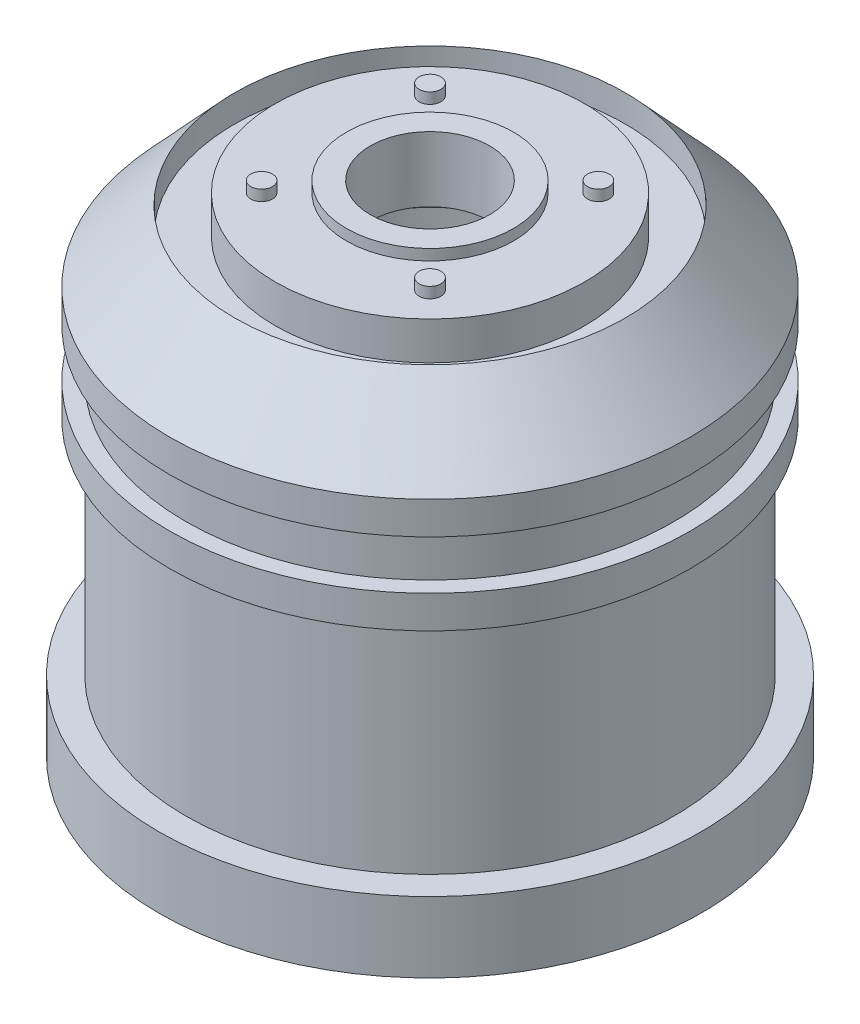
ISO-10303-21;
HEADER;
FILE_DESCRIPTION(('STEP AP214'),'2;1');
FILE_NAME('part.step','',(''),(''),'','','');
FILE_SCHEMA(('AUTOMOTIVE_DESIGN { 1 0 10303 214 1 1 1 1 }'));
ENDSEC;
DATA;
#1=APPLICATION_CONTEXT('core data for automotive mechanical design processes');
#2=APPLICATION_PROTOCOL_DEFINITION('international standard','automotive_design',2000,#1);
#3=PRODUCT_CONTEXT('',#1,'mechanical');
#4=PRODUCT('Part','Part','',(#3));
#5=PRODUCT_RELATED_PRODUCT_CATEGORY('part','',(#4));
#6=PRODUCT_DEFINITION_FORMATION('','',#4);
#7=PRODUCT_DEFINITION_CONTEXT('part definition',#1,'design');
#8=PRODUCT_DEFINITION('design','',#6,#7);
#9=PRODUCT_DEFINITION_SHAPE('','',#8);
#10=(LENGTH_UNIT() NAMED_UNIT(*) SI_UNIT(.MILLI.,.METRE.));
#11=(NAMED_UNIT(*) PLANE_ANGLE_UNIT() SI_UNIT($,.RADIAN.));
#12=(NAMED_UNIT(*) SI_UNIT($,.STERADIAN.) SOLID_ANGLE_UNIT());
#13=UNCERTAINTY_MEASURE_WITH_UNIT(LENGTH_MEASURE(1.E-05),#10,'distance_accuracy_value','');
#14=(GEOMETRIC_REPRESENTATION_CONTEXT(3) GLOBAL_UNCERTAINTY_ASSIGNED_CONTEXT((#13)) GLOBAL_UNIT_ASSIGNED_CONTEXT((#10,
#11,#12)) REPRESENTATION_CONTEXT('',''));
#15=CARTESIAN_POINT('',(0.,0.,0.));
#16=DIRECTION('',(0.,0.,1.));
#17=DIRECTION('',(1.,0.,0.));
#18=AXIS2_PLACEMENT_3D('',#15,#16,#17);
#19=CARTESIAN_POINT('',(0.,20.32,0.));
#20=DIRECTION('',(0.,-1.,0.));
#21=DIRECTION('',(0.,0.,-1.));
#22=AXIS2_PLACEMENT_3D('',#19,#20,#21);
#23=PLANE('',#22);
#24=CARTESIAN_POINT('',(0.,20.32,0.));
#25=DIRECTION('',(0.,-1.,0.));
#26=DIRECTION('',(0.,0.,-1.));
#27=AXIS2_PLACEMENT_3D('',#24,#25,#26);
#28=CIRCLE('',#27,2.794);
#29=CARTESIAN_POINT('',(0.,20.32,-2.794));
#30=VERTEX_POINT('',#29);
#31=EDGE_CURVE('E98',#30,#30,#28,.F.);
#32=ORIENTED_EDGE('',*,*,#31,.T.);
#33=EDGE_LOOP('',(#32));
#34=FACE_BOUND('',#33,.T.);
#35=CARTESIAN_POINT('',(0.,20.32,0.));
#36=DIRECTION('',(0.,-1.,0.));
#37=DIRECTION('',(0.,0.,-1.));
#38=AXIS2_PLACEMENT_3D('',#35,#36,#37);
#39=CIRCLE('',#38,6.35);
#40=CARTESIAN_POINT('',(0.,20.32,-6.35));
#41=VERTEX_POINT('',#40);
#42=EDGE_CURVE('E45',#41,#41,#39,.F.);
#43=ORIENTED_EDGE('',*,*,#42,.F.);
#44=EDGE_LOOP('',(#43));
#45=FACE_BOUND('',#44,.T.);
#46=ADVANCED_FACE('F37',(#34,#45),#23,.T.);
#47=CARTESIAN_POINT('',(0.,3.302,0.));
#48=DIRECTION('',(0.,-1.,0.));
#49=DIRECTION('',(0.,0.,-1.));
#50=AXIS2_PLACEMENT_3D('',#47,#48,#49);
#51=CYLINDRICAL_SURFACE('',#50,12.7);
#52=CARTESIAN_POINT('',(0.,3.302,0.));
#53=DIRECTION('',(0.,1.,0.));
#54=DIRECTION('',(0.,0.,1.));
#55=AXIS2_PLACEMENT_3D('',#52,#53,#54);
#56=CIRCLE('',#55,12.7);
#57=CARTESIAN_POINT('',(0.,3.302,-12.7));
#58=VERTEX_POINT('',#57);
#59=EDGE_CURVE('E62',#58,#58,#56,.T.);
#60=CARTESIAN_POINT('',(0.,0.,0.));
#61=DIRECTION('',(0.,1.,0.));
#62=DIRECTION('',(0.,0.,1.));
#63=AXIS2_PLACEMENT_3D('',#60,#61,#62);
#64=CIRCLE('',#63,12.7);
#65=CARTESIAN_POINT('',(0.,0.,-12.7));
#66=VERTEX_POINT('',#65);
#67=EDGE_CURVE('E58',#66,#66,#64,.T.);
#68=CARTESIAN_POINT('',(0.,3.302,-12.7));
#69=CARTESIAN_POINT('',(0.,3.26760416666667,-12.7));
#70=CARTESIAN_POINT('',(0.,3.23320833333333,-12.7));
#71=CARTESIAN_POINT('',(0.,3.16441666666667,-12.7));
#72=CARTESIAN_POINT('',(0.,3.13002083333333,-12.7));
#73=CARTESIAN_POINT('',(0.,3.06122916666667,-12.7));
#74=CARTESIAN_POINT('',(0.,3.02683333333333,-12.7));
#75=CARTESIAN_POINT('',(0.,2.95804166666667,-12.7));
#76=CARTESIAN_POINT('',(0.,2.92364583333333,-12.7));
#77=CARTESIAN_POINT('',(0.,2.85485416666667,-12.7));
#78=CARTESIAN_POINT('',(0.,2.82045833333333,-12.7));
#79=CARTESIAN_POINT('',(0.,2.75166666666667,-12.7));
#80=CARTESIAN_POINT('',(0.,2.71727083333333,-12.7));
#81=CARTESIAN_POINT('',(0.,2.64847916666667,-12.7));
#82=CARTESIAN_POINT('',(0.,2.61408333333333,-12.7));
#83=CARTESIAN_POINT('',(0.,2.54529166666667,-12.7));
#84=CARTESIAN_POINT('',(0.,2.51089583333333,-12.7));
#85=CARTESIAN_POINT('',(0.,2.44210416666667,-12.7));
#86=CARTESIAN_POINT('',(0.,2.40770833333333,-12.7));
#87=CARTESIAN_POINT('',(0.,2.33891666666667,-12.7));
#88=CARTESIAN_POINT('',(0.,2.30452083333333,-12.7));
#89=CARTESIAN_POINT('',(0.,2.23572916666667,-12.7));
#90=CARTESIAN_POINT('',(0.,2.20133333333333,-12.7));
#91=CARTESIAN_POINT('',(0.,2.13254166666667,-12.7));
#92=CARTESIAN_POINT('',(0.,2.09814583333333,-12.7));
#93=CARTESIAN_POINT('',(0.,2.02935416666667,-12.7));
#94=CARTESIAN_POINT('',(0.,1.99495833333333,-12.7));
#95=CARTESIAN_POINT('',(0.,1.92616666666667,-12.7));
#96=CARTESIAN_POINT('',(0.,1.89177083333333,-12.7));
#97=CARTESIAN_POINT('',(0.,1.82297916666667,-12.7));
#98=CARTESIAN_POINT('',(0.,1.78858333333333,-12.7));
#99=CARTESIAN_POINT('',(0.,1.71979166666667,-12.7));
#100=CARTESIAN_POINT('',(0.,1.68539583333333,-12.7));
#101=CARTESIAN_POINT('',(0.,1.61660416666667,-12.7));
#102=CARTESIAN_POINT('',(0.,1.58220833333333,-12.7));
#103=CARTESIAN_POINT('',(0.,1.51341666666667,-12.7));
#104=CARTESIAN_POINT('',(0.,1.47902083333333,-12.7));
#105=CARTESIAN_POINT('',(0.,1.41022916666667,-12.7));
#106=CARTESIAN_POINT('',(0.,1.37583333333333,-12.7));
#107=CARTESIAN_POINT('',(0.,1.30704166666667,-12.7));
#108=CARTESIAN_POINT('',(0.,1.27264583333333,-12.7));
#109=CARTESIAN_POINT('',(0.,1.20385416666667,-12.7));
#110=CARTESIAN_POINT('',(0.,1.16945833333333,-12.7));
#111=CARTESIAN_POINT('',(0.,1.10066666666667,-12.7));
#112=CARTESIAN_POINT('',(0.,1.06627083333333,-12.7));
#113=CARTESIAN_POINT('',(0.,0.997479166666666,-12.7));
#114=CARTESIAN_POINT('',(0.,0.963083333333333,-12.7));
#115=CARTESIAN_POINT('',(0.,0.894291666666666,-12.7));
#116=CARTESIAN_POINT('',(0.,0.859895833333333,-12.7));
#117=CARTESIAN_POINT('',(0.,0.791104166666666,-12.7));
#118=CARTESIAN_POINT('',(0.,0.756708333333333,-12.7));
#119=CARTESIAN_POINT('',(0.,0.687916666666667,-12.7));
#120=CARTESIAN_POINT('',(0.,0.653520833333333,-12.7));
#121=CARTESIAN_POINT('',(0.,0.584729166666667,-12.7));
#122=CARTESIAN_POINT('',(0.,0.550333333333333,-12.7));
#123=CARTESIAN_POINT('',(0.,0.481541666666667,-12.7));
#124=CARTESIAN_POINT('',(0.,0.447145833333333,-12.7));
#125=CARTESIAN_POINT('',(0.,0.378354166666667,-12.7));
#126=CARTESIAN_POINT('',(0.,0.343958333333333,-12.7));
#127=CARTESIAN_POINT('',(0.,0.275166666666667,-12.7));
#128=CARTESIAN_POINT('',(0.,0.240770833333333,-12.7));
#129=CARTESIAN_POINT('',(0.,0.171979166666667,-12.7));
#130=CARTESIAN_POINT('',(0.,0.137583333333333,-12.7));
#131=CARTESIAN_POINT('',(0.,0.0687916666666666,-12.7));
#132=CARTESIAN_POINT('',(0.,0.0343958333333333,-12.7));
#133=CARTESIAN_POINT('',(0.,0.,-12.7));
#134=B_SPLINE_CURVE_WITH_KNOTS('',3,(#68,#69,#70,#71,#72,#73,#74,#75,#76,#77,#78,#79,#80,#81,
#82,#83,#84,#85,#86,#87,#88,#89,#90,#91,#92,#93,#94,#95,#96,#97,#98,#99,#100,#101,#102,#103,
#104,#105,#106,#107,#108,#109,#110,#111,#112,#113,#114,#115,#116,#117,#118,#119,#120,#121,#122,
#123,#124,#125,#126,#127,#128,#129,#130,#131,#132,#133),.UNSPECIFIED.,.F.,.F.,(4,2,2,2,2,2,2,2,
2,2,2,2,2,2,2,2,2,2,2,2,2,2,2,2,2,2,2,2,2,2,2,2,4),(0.,0.1031875,0.206375,0.3095625,0.41275,
0.5159375,0.619125,0.7223125,0.8255,0.9286875,1.031875,1.1350625,1.23825,1.3414375,1.444625,
1.5478125,1.651,1.7541875,1.857375,1.9605625,2.06375,2.1669375,2.270125,2.3733125,2.4765,
2.5796875,2.682875,2.7860625,2.88925,2.9924375,3.095625,3.1988125,3.302),.UNSPECIFIED.);
#135=EDGE_CURVE('BSEAM39',#58,#66,#134,.T.);
#136=ORIENTED_EDGE('',*,*,#59,.F.);
#137=ORIENTED_EDGE('',*,*,#67,.T.);
#138=ORIENTED_EDGE('',*,*,#135,.T.);
#139=ORIENTED_EDGE('',*,*,#135,.F.);
#140=EDGE_LOOP('',(#136,#138,#137,#139));
#141=FACE_BOUND('',#140,.T.);
#142=ADVANCED_FACE('F39',(#141),#51,.T.);
#143=CARTESIAN_POINT('',(0.,3.302,0.));
#144=DIRECTION('',(0.,1.,0.));
#145=DIRECTION('',(0.,0.,1.));
#146=AXIS2_PLACEMENT_3D('',#143,#144,#145);
#147=PLANE('',#146);
#148=CARTESIAN_POINT('',(0.,3.302,0.));
#149=DIRECTION('',(0.,1.,0.));
#150=DIRECTION('',(0.,0.,1.));
#151=AXIS2_PLACEMENT_3D('',#148,#149,#150);
#152=CIRCLE('',#151,11.43);
#153=CARTESIAN_POINT('',(0.,3.302,11.43));
#154=VERTEX_POINT('',#153);
#155=EDGE_CURVE('E55',#154,#154,#152,.T.);
#156=ORIENTED_EDGE('',*,*,#155,.F.);
#157=EDGE_LOOP('',(#156));
#158=FACE_BOUND('',#157,.T.);
#159=ORIENTED_EDGE('',*,*,#59,.T.);
#160=EDGE_LOOP('',(#159));
#161=FACE_BOUND('',#160,.T.);
#162=ADVANCED_FACE('F245',(#158,#161),#147,.T.);
#163=CARTESIAN_POINT('',(0.,0.,0.));
#164=DIRECTION('',(0.,1.,0.));
#165=DIRECTION('',(0.,0.,1.));
#166=AXIS2_PLACEMENT_3D('',#163,#164,#165);
#167=PLANE('',#166);
#168=CARTESIAN_POINT('',(0.,0.,0.));
#169=DIRECTION('',(0.,-1.,0.));
#170=DIRECTION('',(0.,0.,-1.));
#171=AXIS2_PLACEMENT_3D('',#168,#169,#170);
#172=CIRCLE('',#171,9.525);
#173=CARTESIAN_POINT('',(0.,0.,-9.525));
#174=VERTEX_POINT('',#173);
#175=EDGE_CURVE('E90',#174,#174,#172,.T.);
#176=ORIENTED_EDGE('',*,*,#175,.F.);
#177=EDGE_LOOP('',(#176));
#178=FACE_BOUND('',#177,.T.);
#179=ORIENTED_EDGE('',*,*,#67,.F.);
#180=EDGE_LOOP('',(#179));
#181=FACE_BOUND('',#180,.T.);
#182=ADVANCED_FACE('F406',(#178,#181),#167,.F.);
#183=CARTESIAN_POINT('',(0.,13.716,0.));
#184=DIRECTION('',(0.,-1.,0.));
#185=DIRECTION('',(0.,0.,-1.));
#186=AXIS2_PLACEMENT_3D('',#183,#184,#185);
#187=CYLINDRICAL_SURFACE('',#186,11.43);
#188=CARTESIAN_POINT('',(0.,13.716,0.));
#189=DIRECTION('',(0.,1.,0.));
#190=DIRECTION('',(0.,0.,1.));
#191=AXIS2_PLACEMENT_3D('',#188,#189,#190);
#192=CIRCLE('',#191,11.43);
#193=CARTESIAN_POINT('',(0.,13.716,11.43));
#194=VERTEX_POINT('',#193);
#195=EDGE_CURVE('E63',#194,#194,#192,.T.);
#196=ORIENTED_EDGE('',*,*,#195,.F.);
#197=EDGE_LOOP('',(#196));
#198=FACE_BOUND('',#197,.T.);
#199=ORIENTED_EDGE('',*,*,#155,.T.);
#200=EDGE_LOOP('',(#199));
#201=FACE_BOUND('',#200,.T.);
#202=ADVANCED_FACE('F410',(#198,#201),#187,.T.);
#203=CARTESIAN_POINT('',(0.,15.24,0.));
#204=DIRECTION('',(0.,-1.,0.));
#205=DIRECTION('',(0.,0.,-1.));
#206=AXIS2_PLACEMENT_3D('',#203,#204,#205);
#207=CYLINDRICAL_SURFACE('',#206,12.192);
#208=CARTESIAN_POINT('',(0.,15.24,0.));
#209=DIRECTION('',(0.,1.,0.));
#210=DIRECTION('',(0.,0.,1.));
#211=AXIS2_PLACEMENT_3D('',#208,#209,#210);
#212=CIRCLE('',#211,12.192);
#213=CARTESIAN_POINT('',(0.,15.24,-12.192));
#214=VERTEX_POINT('',#213);
#215=EDGE_CURVE('E73',#214,#214,#212,.T.);
#216=CARTESIAN_POINT('',(0.,13.716,0.));
#217=DIRECTION('',(0.,1.,0.));
#218=DIRECTION('',(0.,0.,1.));
#219=AXIS2_PLACEMENT_3D('',#216,#217,#218);
#220=CIRCLE('',#219,12.192);
#221=CARTESIAN_POINT('',(0.,13.716,-12.192));
#222=VERTEX_POINT('',#221);
#223=EDGE_CURVE('E74',#222,#222,#220,.T.);
#224=CARTESIAN_POINT('',(0.,15.24,-12.192));
#225=CARTESIAN_POINT('',(0.,15.224125,-12.192));
#226=CARTESIAN_POINT('',(0.,15.20825,-12.192));
#227=CARTESIAN_POINT('',(0.,15.1765,-12.192));
#228=CARTESIAN_POINT('',(0.,15.160625,-12.192));
#229=CARTESIAN_POINT('',(0.,15.128875,-12.192));
#230=CARTESIAN_POINT('',(0.,15.113,-12.192));
#231=CARTESIAN_POINT('',(0.,15.08125,-12.192));
#232=CARTESIAN_POINT('',(0.,15.065375,-12.192));
#233=CARTESIAN_POINT('',(0.,15.033625,-12.192));
#234=CARTESIAN_POINT('',(0.,15.01775,-12.192));
#235=CARTESIAN_POINT('',(0.,14.986,-12.192));
#236=CARTESIAN_POINT('',(0.,14.970125,-12.192));
#237=CARTESIAN_POINT('',(0.,14.938375,-12.192));
#238=CARTESIAN_POINT('',(0.,14.9225,-12.192));
#239=CARTESIAN_POINT('',(0.,14.89075,-12.192));
#240=CARTESIAN_POINT('',(0.,14.874875,-12.192));
#241=CARTESIAN_POINT('',(0.,14.843125,-12.192));
#242=CARTESIAN_POINT('',(0.,14.82725,-12.192));
#243=CARTESIAN_POINT('',(0.,14.7955,-12.192));
#244=CARTESIAN_POINT('',(0.,14.779625,-12.192));
#245=CARTESIAN_POINT('',(0.,14.747875,-12.192));
#246=CARTESIAN_POINT('',(0.,14.732,-12.192));
#247=CARTESIAN_POINT('',(0.,14.70025,-12.192));
#248=CARTESIAN_POINT('',(0.,14.684375,-12.192));
#249=CARTESIAN_POINT('',(0.,14.652625,-12.192));
#250=CARTESIAN_POINT('',(0.,14.63675,-12.192));
#251=CARTESIAN_POINT('',(0.,14.605,-12.192));
#252=CARTESIAN_POINT('',(0.,14.589125,-12.192));
#253=CARTESIAN_POINT('',(0.,14.557375,-12.192));
#254=CARTESIAN_POINT('',(0.,14.5415,-12.192));
#255=CARTESIAN_POINT('',(0.,14.50975,-12.192));
#256=CARTESIAN_POINT('',(0.,14.493875,-12.192));
#257=CARTESIAN_POINT('',(0.,14.462125,-12.192));
#258=CARTESIAN_POINT('',(0.,14.44625,-12.192));
#259=CARTESIAN_POINT('',(0.,14.4145,-12.192));
#260=CARTESIAN_POINT('',(0.,14.398625,-12.192));
#261=CARTESIAN_POINT('',(0.,14.366875,-12.192));
#262=CARTESIAN_POINT('',(0.,14.351,-12.192));
#263=CARTESIAN_POINT('',(0.,14.31925,-12.192));
#264=CARTESIAN_POINT('',(0.,14.303375,-12.192));
#265=CARTESIAN_POINT('',(0.,14.271625,-12.192));
#266=CARTESIAN_POINT('',(0.,14.25575,-12.192));
#267=CARTESIAN_POINT('',(0.,14.224,-12.192));
#268=CARTESIAN_POINT('',(0.,14.208125,-12.192));
#269=CARTESIAN_POINT('',(0.,14.176375,-12.192));
#270=CARTESIAN_POINT('',(0.,14.1605,-12.192));
#271=CARTESIAN_POINT('',(0.,14.12875,-12.192));
#272=CARTESIAN_POINT('',(0.,14.112875,-12.192));
#273=CARTESIAN_POINT('',(0.,14.081125,-12.192));
#274=CARTESIAN_POINT('',(0.,14.06525,-12.192));
#275=CARTESIAN_POINT('',(0.,14.0335,-12.192));
#276=CARTESIAN_POINT('',(0.,14.017625,-12.192));
#277=CARTESIAN_POINT('',(0.,13.985875,-12.192));
#278=CARTESIAN_POINT('',(0.,13.97,-12.192));
#279=CARTESIAN_POINT('',(0.,13.93825,-12.192));
#280=CARTESIAN_POINT('',(0.,13.922375,-12.192));
#281=CARTESIAN_POINT('',(0.,13.890625,-12.192));
#282=CARTESIAN_POINT('',(0.,13.87475,-12.192));
#283=CARTESIAN_POINT('',(0.,13.843,-12.192));
#284=CARTESIAN_POINT('',(0.,13.827125,-12.192));
#285=CARTESIAN_POINT('',(0.,13.795375,-12.192));
#286=CARTESIAN_POINT('',(0.,13.7795,-12.192));
#287=CARTESIAN_POINT('',(0.,13.74775,-12.192));
#288=CARTESIAN_POINT('',(0.,13.731875,-12.192));
#289=CARTESIAN_POINT('',(0.,13.716,-12.192));
#290=B_SPLINE_CURVE_WITH_KNOTS('',3,(#224,#225,#226,#227,#228,#229,#230,#231,#232,#233,#234,
#235,#236,#237,#238,#239,#240,#241,#242,#243,#244,#245,#246,#247,#248,#249,#250,#251,#252,#253,
#254,#255,#256,#257,#258,#259,#260,#261,#262,#263,#264,#265,#266,#267,#268,#269,#270,#271,#272,
#273,#274,#275,#276,#277,#278,#279,#280,#281,#282,#283,#284,#285,#286,#287,#288,#289),
.UNSPECIFIED.,.F.,.F.,(4,2,2,2,2,2,2,2,2,2,2,2,2,2,2,2,2,2,2,2,2,2,2,2,2,2,2,2,2,2,2,2,4),(0.,
0.0476250000000008,0.0952500000000016,0.142875000000001,0.190500000000001,0.238125,
0.285750000000001,0.333375,0.381000000000001,0.428625,0.476250000000001,0.523875,
0.571500000000001,0.619125,0.666750000000001,0.714375000000001,0.762000000000001,
0.809625000000001,0.85725,0.904875000000001,0.9525,1.000125,1.04775,1.095375,1.143,1.190625,
1.23825,1.285875,1.3335,1.381125,1.42875,1.476375,1.524),.UNSPECIFIED.);
#291=EDGE_CURVE('BSEAM447',#214,#222,#290,.T.);
#292=ORIENTED_EDGE('',*,*,#215,.F.);
#293=ORIENTED_EDGE('',*,*,#223,.T.);
#294=ORIENTED_EDGE('',*,*,#291,.T.);
#295=ORIENTED_EDGE('',*,*,#291,.F.);
#296=EDGE_LOOP('',(#292,#294,#293,#295));
#297=FACE_BOUND('',#296,.T.);
#298=ADVANCED_FACE('F447',(#297),#207,.T.);
#299=CARTESIAN_POINT('',(0.,15.24,0.));
#300=DIRECTION('',(0.,1.,0.));
#301=DIRECTION('',(0.,0.,1.));
#302=AXIS2_PLACEMENT_3D('',#299,#300,#301);
#303=PLANE('',#302);
#304=CARTESIAN_POINT('',(0.,15.24,0.));
#305=DIRECTION('',(0.,1.,0.));
#306=DIRECTION('',(0.,0.,1.));
#307=AXIS2_PLACEMENT_3D('',#304,#305,#306);
#308=CIRCLE('',#307,11.43);
#309=CARTESIAN_POINT('',(0.,15.24,11.43));
#310=VERTEX_POINT('',#309);
#311=EDGE_CURVE('E50',#310,#310,#308,.T.);
#312=ORIENTED_EDGE('',*,*,#311,.F.);
#313=EDGE_LOOP('',(#312));
#314=FACE_BOUND('',#313,.T.);
#315=ORIENTED_EDGE('',*,*,#215,.T.);
#316=EDGE_LOOP('',(#315));
#317=FACE_BOUND('',#316,.T.);
#318=ADVANCED_FACE('F442',(#314,#317),#303,.T.);
#319=CARTESIAN_POINT('',(0.,13.716,0.));
#320=DIRECTION('',(0.,1.,0.));
#321=DIRECTION('',(0.,0.,1.));
#322=AXIS2_PLACEMENT_3D('',#319,#320,#321);
#323=PLANE('',#322);
#324=ORIENTED_EDGE('',*,*,#195,.T.);
#325=EDGE_LOOP('',(#324));
#326=FACE_BOUND('',#325,.T.);
#327=ORIENTED_EDGE('',*,*,#223,.F.);
#328=EDGE_LOOP('',(#327));
#329=FACE_BOUND('',#328,.T.);
#330=ADVANCED_FACE('F434',(#326,#329),#323,.F.);
#331=CARTESIAN_POINT('',(0.,17.526,0.));
#332=DIRECTION('',(0.,-1.,0.));
#333=DIRECTION('',(0.,0.,-1.));
#334=AXIS2_PLACEMENT_3D('',#331,#332,#333);
#335=CYLINDRICAL_SURFACE('',#334,11.43);
#336=CARTESIAN_POINT('',(0.,17.526,0.));
#337=DIRECTION('',(0.,1.,0.));
#338=DIRECTION('',(0.,0.,1.));
#339=AXIS2_PLACEMENT_3D('',#336,#337,#338);
#340=CIRCLE('',#339,11.43);
#341=CARTESIAN_POINT('',(0.,17.526,11.43));
#342=VERTEX_POINT('',#341);
#343=EDGE_CURVE('E78',#342,#342,#340,.T.);
#344=ORIENTED_EDGE('',*,*,#343,.F.);
#345=EDGE_LOOP('',(#344));
#346=FACE_BOUND('',#345,.T.);
#347=ORIENTED_EDGE('',*,*,#311,.T.);
#348=EDGE_LOOP('',(#347));
#349=FACE_BOUND('',#348,.T.);
#350=ADVANCED_FACE('F226',(#346,#349),#335,.T.);
#351=CARTESIAN_POINT('',(0.,19.05,0.));
#352=DIRECTION('',(0.,-1.,0.));
#353=DIRECTION('',(0.,0.,-1.));
#354=AXIS2_PLACEMENT_3D('',#351,#352,#353);
#355=CYLINDRICAL_SURFACE('',#354,12.192);
#356=CARTESIAN_POINT('',(0.,19.05,0.));
#357=DIRECTION('',(0.,1.,0.));
#358=DIRECTION('',(0.,0.,1.));
#359=AXIS2_PLACEMENT_3D('',#356,#357,#358);
#360=CIRCLE('',#359,12.192);
#361=CARTESIAN_POINT('',(0.,19.05,-12.192));
#362=VERTEX_POINT('',#361);
#363=EDGE_CURVE('E85',#362,#362,#360,.T.);
#364=CARTESIAN_POINT('',(0.,17.526,0.));
#365=DIRECTION('',(0.,1.,0.));
#366=DIRECTION('',(0.,0.,1.));
#367=AXIS2_PLACEMENT_3D('',#364,#365,#366);
#368=CIRCLE('',#367,12.192);
#369=CARTESIAN_POINT('',(0.,17.526,-12.192));
#370=VERTEX_POINT('',#369);
#371=EDGE_CURVE('E86',#370,#370,#368,.T.);
#372=CARTESIAN_POINT('',(0.,19.05,-12.192));
#373=CARTESIAN_POINT('',(0.,19.034125,-12.192));
#374=CARTESIAN_POINT('',(0.,19.01825,-12.192));
#375=CARTESIAN_POINT('',(0.,18.9865,-12.192));
#376=CARTESIAN_POINT('',(0.,18.970625,-12.192));
#377=CARTESIAN_POINT('',(0.,18.938875,-12.192));
#378=CARTESIAN_POINT('',(0.,18.923,-12.192));
#379=CARTESIAN_POINT('',(0.,18.89125,-12.192));
#380=CARTESIAN_POINT('',(0.,18.875375,-12.192));
#381=CARTESIAN_POINT('',(0.,18.843625,-12.192));
#382=CARTESIAN_POINT('',(0.,18.82775,-12.192));
#383=CARTESIAN_POINT('',(0.,18.796,-12.192));
#384=CARTESIAN_POINT('',(0.,18.780125,-12.192));
#385=CARTESIAN_POINT('',(0.,18.748375,-12.192));
#386=CARTESIAN_POINT('',(0.,18.7325,-12.192));
#387=CARTESIAN_POINT('',(0.,18.70075,-12.192));
#388=CARTESIAN_POINT('',(0.,18.684875,-12.192));
#389=CARTESIAN_POINT('',(0.,18.653125,-12.192));
#390=CARTESIAN_POINT('',(0.,18.63725,-12.192));
#391=CARTESIAN_POINT('',(0.,18.6055,-12.192));
#392=CARTESIAN_POINT('',(0.,18.589625,-12.192));
#393=CARTESIAN_POINT('',(0.,18.557875,-12.192));
#394=CARTESIAN_POINT('',(0.,18.542,-12.192));
#395=CARTESIAN_POINT('',(0.,18.51025,-12.192));
#396=CARTESIAN_POINT('',(0.,18.494375,-12.192));
#397=CARTESIAN_POINT('',(0.,18.462625,-12.192));
#398=CARTESIAN_POINT('',(0.,18.44675,-12.192));
#399=CARTESIAN_POINT('',(0.,18.415,-12.192));
#400=CARTESIAN_POINT('',(0.,18.399125,-12.192));
#401=CARTESIAN_POINT('',(0.,18.367375,-12.192));
#402=CARTESIAN_POINT('',(0.,18.3515,-12.192));
#403=CARTESIAN_POINT('',(0.,18.31975,-12.192));
#404=CARTESIAN_POINT('',(0.,18.303875,-12.192));
#405=CARTESIAN_POINT('',(0.,18.272125,-12.192));
#406=CARTESIAN_POINT('',(0.,18.25625,-12.192));
#407=CARTESIAN_POINT('',(0.,18.2245,-12.192));
#408=CARTESIAN_POINT('',(0.,18.208625,-12.192));
#409=CARTESIAN_POINT('',(0.,18.176875,-12.192));
#410=CARTESIAN_POINT('',(0.,18.161,-12.192));
#411=CARTESIAN_POINT('',(0.,18.12925,-12.192));
#412=CARTESIAN_POINT('',(0.,18.113375,-12.192));
#413=CARTESIAN_POINT('',(0.,18.081625,-12.192));
#414=CARTESIAN_POINT('',(0.,18.06575,-12.192));
#415=CARTESIAN_POINT('',(0.,18.034,-12.192));
#416=CARTESIAN_POINT('',(0.,18.018125,-12.192));
#417=CARTESIAN_POINT('',(0.,17.986375,-12.192));
#418=CARTESIAN_POINT('',(0.,17.9705,-12.192));
#419=CARTESIAN_POINT('',(0.,17.93875,-12.192));
#420=CARTESIAN_POINT('',(0.,17.922875,-12.192));
#421=CARTESIAN_POINT('',(0.,17.891125,-12.192));
#422=CARTESIAN_POINT('',(0.,17.87525,-12.192));
#423=CARTESIAN_POINT('',(0.,17.8435,-12.192));
#424=CARTESIAN_POINT('',(0.,17.827625,-12.192));
#425=CARTESIAN_POINT('',(0.,17.795875,-12.192));
#426=CARTESIAN_POINT('',(0.,17.78,-12.192));
#427=CARTESIAN_POINT('',(0.,17.74825,-12.192));
#428=CARTESIAN_POINT('',(0.,17.732375,-12.192));
#429=CARTESIAN_POINT('',(0.,17.700625,-12.192));
#430=CARTESIAN_POINT('',(0.,17.68475,-12.192));
#431=CARTESIAN_POINT('',(0.,17.653,-12.192));
#432=CARTESIAN_POINT('',(0.,17.637125,-12.192));
#433=CARTESIAN_POINT('',(0.,17.605375,-12.192));
#434=CARTESIAN_POINT('',(0.,17.5895,-12.192));
#435=CARTESIAN_POINT('',(0.,17.55775,-12.192));
#436=CARTESIAN_POINT('',(0.,17.541875,-12.192));
#437=CARTESIAN_POINT('',(0.,17.526,-12.192));
#438=B_SPLINE_CURVE_WITH_KNOTS('',3,(#372,#373,#374,#375,#376,#377,#378,#379,#380,#381,#382,
#383,#384,#385,#386,#387,#388,#389,#390,#391,#392,#393,#394,#395,#396,#397,#398,#399,#400,#401,
#402,#403,#404,#405,#406,#407,#408,#409,#410,#411,#412,#413,#414,#415,#416,#417,#418,#419,#420,
#421,#422,#423,#424,#425,#426,#427,#428,#429,#430,#431,#432,#433,#434,#435,#436,#437),
.UNSPECIFIED.,.F.,.F.,(4,2,2,2,2,2,2,2,2,2,2,2,2,2,2,2,2,2,2,2,2,2,2,2,2,2,2,2,2,2,2,2,4),(0.,
0.0476250000000025,0.0952500000000016,0.142875000000001,0.190500000000003,0.238125000000002,
0.285750000000001,0.333375,0.381000000000003,0.428625000000002,0.476250000000001,
0.523875000000004,0.571500000000003,0.619125000000002,0.666750000000001,0.714375000000003,
0.762000000000002,0.809625000000001,0.857250000000004,0.904875000000003,0.952500000000002,
1.000125,1.04775,1.095375,1.143,1.190625,1.23825,1.285875,1.3335,1.381125,1.42875,1.476375,
1.524),.UNSPECIFIED.);
#439=EDGE_CURVE('BSEAM222',#362,#370,#438,.T.);
#440=ORIENTED_EDGE('',*,*,#363,.F.);
#441=ORIENTED_EDGE('',*,*,#371,.T.);
#442=ORIENTED_EDGE('',*,*,#439,.T.);
#443=ORIENTED_EDGE('',*,*,#439,.F.);
#444=EDGE_LOOP('',(#440,#442,#441,#443));
#445=FACE_BOUND('',#444,.T.);
#446=ADVANCED_FACE('F222',(#445),#355,.T.);
#447=CARTESIAN_POINT('',(0.,17.526,0.));
#448=DIRECTION('',(0.,1.,0.));
#449=DIRECTION('',(0.,0.,1.));
#450=AXIS2_PLACEMENT_3D('',#447,#448,#449);
#451=PLANE('',#450);
#452=ORIENTED_EDGE('',*,*,#343,.T.);
#453=EDGE_LOOP('',(#452));
#454=FACE_BOUND('',#453,.T.);
#455=ORIENTED_EDGE('',*,*,#371,.F.);
#456=EDGE_LOOP('',(#455));
#457=FACE_BOUND('',#456,.T.);
#458=ADVANCED_FACE('F225',(#454,#457),#451,.F.);
#459=CARTESIAN_POINT('',(0.,20.32,0.));
#460=DIRECTION('',(0.,-1.,0.));
#461=DIRECTION('',(0.,0.,-1.));
#462=AXIS2_PLACEMENT_3D('',#459,#460,#461);
#463=CYLINDRICAL_SURFACE('',#462,9.525);
#464=ORIENTED_EDGE('',*,*,#175,.T.);
#465=EDGE_LOOP('',(#464));
#466=FACE_BOUND('',#465,.T.);
#467=CARTESIAN_POINT('',(0.,20.32,0.));
#468=DIRECTION('',(0.,-1.,0.));
#469=DIRECTION('',(0.,0.,-1.));
#470=AXIS2_PLACEMENT_3D('',#467,#468,#469);
#471=CIRCLE('',#470,9.525);
#472=CARTESIAN_POINT('',(0.,20.32,-9.525));
#473=VERTEX_POINT('',#472);
#474=EDGE_CURVE('E103',#473,#473,#471,.T.);
#475=ORIENTED_EDGE('',*,*,#474,.F.);
#476=EDGE_LOOP('',(#475));
#477=FACE_BOUND('',#476,.T.);
#478=ADVANCED_FACE('F231',(#466,#477),#463,.F.);
#479=CARTESIAN_POINT('',(0.,0.,0.));
#480=DIRECTION('',(0.,1.,0.));
#481=DIRECTION('',(0.,0.,1.));
#482=AXIS2_PLACEMENT_3D('',#479,#480,#481);
#483=CYLINDRICAL_SURFACE('',#482,2.794);
#484=ORIENTED_EDGE('',*,*,#31,.F.);
#485=EDGE_LOOP('',(#484));
#486=FACE_BOUND('',#485,.T.);
#487=CARTESIAN_POINT('',(0.,23.368,0.));
#488=DIRECTION('',(0.,1.,0.));
#489=DIRECTION('',(0.,0.,1.));
#490=AXIS2_PLACEMENT_3D('',#487,#488,#489);
#491=CIRCLE('',#490,2.794);
#492=CARTESIAN_POINT('',(0.,23.368,2.794));
#493=VERTEX_POINT('',#492);
#494=EDGE_CURVE('E137',#493,#493,#491,.T.);
#495=ORIENTED_EDGE('',*,*,#494,.T.);
#496=EDGE_LOOP('',(#495));
#497=FACE_BOUND('',#496,.T.);
#498=ADVANCED_FACE('F218',(#486,#497),#483,.F.);
#499=CARTESIAN_POINT('',(0.,19.05,0.));
#500=DIRECTION('',(0.,-1.,0.));
#501=DIRECTION('',(0.,0.,1.));
#502=AXIS2_PLACEMENT_3D('',#499,#500,#501);
#503=CONICAL_SURFACE('',#502,12.192,0.745731589361555);
#504=CARTESIAN_POINT('',(0.,22.352,0.));
#505=DIRECTION('',(0.,1.,0.));
#506=DIRECTION('',(0.,0.,1.));
#507=AXIS2_PLACEMENT_3D('',#504,#505,#506);
#508=CIRCLE('',#507,9.14209071027293);
#509=CARTESIAN_POINT('',(0.,22.352,9.14209071027293));
#510=VERTEX_POINT('',#509);
#511=EDGE_CURVE('E107',#510,#510,#508,.T.);
#512=ORIENTED_EDGE('',*,*,#511,.F.);
#513=EDGE_LOOP('',(#512));
#514=FACE_BOUND('',#513,.T.);
#515=ORIENTED_EDGE('',*,*,#363,.T.);
#516=EDGE_LOOP('',(#515));
#517=FACE_BOUND('',#516,.T.);
#518=ADVANCED_FACE('F212',(#514,#517),#503,.T.);
#519=CARTESIAN_POINT('',(0.,21.082,0.));
#520=DIRECTION('',(0.,1.,0.));
#521=DIRECTION('',(0.,0.,1.));
#522=AXIS2_PLACEMENT_3D('',#519,#520,#521);
#523=CYLINDRICAL_SURFACE('',#522,9.14209071027293);
#524=CARTESIAN_POINT('',(0.,21.082,0.));
#525=DIRECTION('',(0.,1.,0.));
#526=DIRECTION('',(0.,0.,1.));
#527=AXIS2_PLACEMENT_3D('',#524,#525,#526);
#528=CIRCLE('',#527,9.14209071027293);
#529=CARTESIAN_POINT('',(0.,21.082,9.14209071027293));
#530=VERTEX_POINT('',#529);
#531=EDGE_CURVE('E97',#530,#530,#528,.T.);
#532=ORIENTED_EDGE('',*,*,#531,.F.);
#533=EDGE_LOOP('',(#532));
#534=FACE_BOUND('',#533,.T.);
#535=ORIENTED_EDGE('',*,*,#511,.T.);
#536=EDGE_LOOP('',(#535));
#537=FACE_BOUND('',#536,.T.);
#538=ADVANCED_FACE('F206',(#534,#537),#523,.F.);
#539=CARTESIAN_POINT('',(0.,21.082,0.));
#540=DIRECTION('',(0.,1.,0.));
#541=DIRECTION('',(0.,0.,1.));
#542=AXIS2_PLACEMENT_3D('',#539,#540,#541);
#543=PLANE('',#542);
#544=CARTESIAN_POINT('',(0.,21.082,0.));
#545=DIRECTION('',(0.,1.,0.));
#546=DIRECTION('',(0.,0.,1.));
#547=AXIS2_PLACEMENT_3D('',#544,#545,#546);
#548=CIRCLE('',#547,7.239);
#549=CARTESIAN_POINT('',(0.,21.082,7.239));
#550=VERTEX_POINT('',#549);
#551=EDGE_CURVE('E102',#550,#550,#548,.T.);
#552=ORIENTED_EDGE('',*,*,#551,.F.);
#553=EDGE_LOOP('',(#552));
#554=FACE_BOUND('',#553,.T.);
#555=ORIENTED_EDGE('',*,*,#531,.T.);
#556=EDGE_LOOP('',(#555));
#557=FACE_BOUND('',#556,.T.);
#558=ADVANCED_FACE('F200',(#554,#557),#543,.T.);
#559=CARTESIAN_POINT('',(0.,22.86,0.));
#560=DIRECTION('',(0.,-1.,0.));
#561=DIRECTION('',(0.,0.,-1.));
#562=AXIS2_PLACEMENT_3D('',#559,#560,#561);
#563=CYLINDRICAL_SURFACE('',#562,7.239);
#564=CARTESIAN_POINT('',(0.,22.86,0.));
#565=DIRECTION('',(0.,1.,0.));
#566=DIRECTION('',(0.,0.,1.));
#567=AXIS2_PLACEMENT_3D('',#564,#565,#566);
#568=CIRCLE('',#567,7.239);
#569=CARTESIAN_POINT('',(0.,22.86,7.239));
#570=VERTEX_POINT('',#569);
#571=EDGE_CURVE('E111',#570,#570,#568,.T.);
#572=ORIENTED_EDGE('',*,*,#571,.F.);
#573=EDGE_LOOP('',(#572));
#574=FACE_BOUND('',#573,.T.);
#575=ORIENTED_EDGE('',*,*,#551,.T.);
#576=EDGE_LOOP('',(#575));
#577=FACE_BOUND('',#576,.T.);
#578=ADVANCED_FACE('F187',(#574,#577),#563,.T.);
#579=CARTESIAN_POINT('',(0.,22.86,0.));
#580=DIRECTION('',(0.,1.,0.));
#581=DIRECTION('',(0.,0.,1.));
#582=AXIS2_PLACEMENT_3D('',#579,#580,#581);
#583=PLANE('',#582);
#584=CARTESIAN_POINT('',(3.94201392674785,22.86,-3.94201392674781));
#585=DIRECTION('',(0.,1.,0.));
#586=DIRECTION('',(0.,0.,1.));
#587=AXIS2_PLACEMENT_3D('',#584,#585,#586);
#588=CIRCLE('',#587,0.508);
#589=CARTESIAN_POINT('',(3.94201392674785,22.86,-3.43401392674781));
#590=VERTEX_POINT('',#589);
#591=EDGE_CURVE('E166',#590,#590,#588,.T.);
#592=ORIENTED_EDGE('',*,*,#591,.F.);
#593=EDGE_LOOP('',(#592));
#594=FACE_BOUND('',#593,.T.);
#595=CARTESIAN_POINT('',(-3.94201392674782,22.86,-3.94201392674783));
#596=DIRECTION('',(0.,1.,0.));
#597=DIRECTION('',(0.,0.,1.));
#598=AXIS2_PLACEMENT_3D('',#595,#596,#597);
#599=CIRCLE('',#598,0.508);
#600=CARTESIAN_POINT('',(-3.94201392674782,22.86,-3.43401392674783));
#601=VERTEX_POINT('',#600);
#602=EDGE_CURVE('E158',#601,#601,#599,.T.);
#603=ORIENTED_EDGE('',*,*,#602,.F.);
#604=EDGE_LOOP('',(#603));
#605=FACE_BOUND('',#604,.T.);
#606=CARTESIAN_POINT('',(-3.94201392674782,22.86,3.94201392674783));
#607=DIRECTION('',(0.,1.,0.));
#608=DIRECTION('',(0.,0.,1.));
#609=AXIS2_PLACEMENT_3D('',#606,#607,#608);
#610=CIRCLE('',#609,0.508);
#611=CARTESIAN_POINT('',(-3.94201392674782,22.86,4.45001392674784));
#612=VERTEX_POINT('',#611);
#613=EDGE_CURVE('E150',#612,#612,#610,.T.);
#614=ORIENTED_EDGE('',*,*,#613,.F.);
#615=EDGE_LOOP('',(#614));
#616=FACE_BOUND('',#615,.T.);
#617=CARTESIAN_POINT('',(3.94201392674785,22.86,3.9420139267478));
#618=DIRECTION('',(0.,1.,0.));
#619=DIRECTION('',(0.,0.,1.));
#620=AXIS2_PLACEMENT_3D('',#617,#618,#619);
#621=CIRCLE('',#620,0.508);
#622=CARTESIAN_POINT('',(3.94201392674785,22.86,4.4500139267478));
#623=VERTEX_POINT('',#622);
#624=EDGE_CURVE('E142',#623,#623,#621,.T.);
#625=ORIENTED_EDGE('',*,*,#624,.F.);
#626=EDGE_LOOP('',(#625));
#627=FACE_BOUND('',#626,.T.);
#628=CARTESIAN_POINT('',(0.,22.86,0.));
#629=DIRECTION('',(0.,1.,0.));
#630=DIRECTION('',(0.,0.,1.));
#631=AXIS2_PLACEMENT_3D('',#628,#629,#630);
#632=CIRCLE('',#631,3.9111495582704);
#633=CARTESIAN_POINT('',(0.,22.86,3.9111495582704));
#634=VERTEX_POINT('',#633);
#635=EDGE_CURVE('E10',#634,#634,#632,.T.);
#636=ORIENTED_EDGE('',*,*,#635,.F.);
#637=EDGE_LOOP('',(#636));
#638=FACE_BOUND('',#637,.T.);
#639=ORIENTED_EDGE('',*,*,#571,.T.);
#640=EDGE_LOOP('',(#639));
#641=FACE_BOUND('',#640,.T.);
#642=ADVANCED_FACE('F183',(#594,#605,#616,#627,#638,#641),#583,.T.);
#643=CARTESIAN_POINT('',(0.,20.32,0.));
#644=DIRECTION('',(0.,-1.,0.));
#645=DIRECTION('',(0.,0.,-1.));
#646=AXIS2_PLACEMENT_3D('',#643,#644,#645);
#647=CIRCLE('',#646,7.239);
#648=CARTESIAN_POINT('',(0.,20.32,-7.239));
#649=VERTEX_POINT('',#648);
#650=EDGE_CURVE('E122',#649,#649,#647,.T.);
#651=ORIENTED_EDGE('',*,*,#650,.F.);
#652=EDGE_LOOP('',(#651));
#653=FACE_BOUND('',#652,.T.);
#654=ORIENTED_EDGE('',*,*,#474,.T.);
#655=EDGE_LOOP('',(#654));
#656=FACE_BOUND('',#655,.T.);
#657=ADVANCED_FACE('F186',(#653,#656),#23,.T.);
#658=CARTESIAN_POINT('',(0.,17.78,0.));
#659=DIRECTION('',(0.,-1.,0.));
#660=DIRECTION('',(0.,0.,-1.));
#661=AXIS2_PLACEMENT_3D('',#658,#659,#660);
#662=PLANE('',#661);
#663=CARTESIAN_POINT('',(0.,17.78,0.));
#664=DIRECTION('',(0.,-1.,0.));
#665=DIRECTION('',(0.,0.,-1.));
#666=AXIS2_PLACEMENT_3D('',#663,#664,#665);
#667=CIRCLE('',#666,7.239);
#668=CARTESIAN_POINT('',(0.,17.78,-7.239));
#669=VERTEX_POINT('',#668);
#670=EDGE_CURVE('E121',#669,#669,#667,.T.);
#671=ORIENTED_EDGE('',*,*,#670,.T.);
#672=EDGE_LOOP('',(#671));
#673=FACE_BOUND('',#672,.T.);
#674=CARTESIAN_POINT('',(0.,17.78,0.));
#675=DIRECTION('',(0.,-1.,0.));
#676=DIRECTION('',(0.,0.,-1.));
#677=AXIS2_PLACEMENT_3D('',#674,#675,#676);
#678=CIRCLE('',#677,6.35);
#679=CARTESIAN_POINT('',(0.,17.78,-6.35));
#680=VERTEX_POINT('',#679);
#681=EDGE_CURVE('E126',#680,#680,#678,.T.);
#682=ORIENTED_EDGE('',*,*,#681,.F.);
#683=EDGE_LOOP('',(#682));
#684=FACE_BOUND('',#683,.T.);
#685=ADVANCED_FACE('F251',(#673,#684),#662,.T.);
#686=CARTESIAN_POINT('',(0.,17.78,0.));
#687=DIRECTION('',(0.,1.,0.));
#688=DIRECTION('',(0.,0.,1.));
#689=AXIS2_PLACEMENT_3D('',#686,#687,#688);
#690=CYLINDRICAL_SURFACE('',#689,7.239);
#691=ORIENTED_EDGE('',*,*,#670,.F.);
#692=EDGE_LOOP('',(#691));
#693=FACE_BOUND('',#692,.T.);
#694=ORIENTED_EDGE('',*,*,#650,.T.);
#695=EDGE_LOOP('',(#694));
#696=FACE_BOUND('',#695,.T.);
#697=ADVANCED_FACE('F256',(#693,#696),#690,.T.);
#698=CARTESIAN_POINT('',(0.,17.78,0.));
#699=DIRECTION('',(0.,1.,0.));
#700=DIRECTION('',(0.,0.,1.));
#701=AXIS2_PLACEMENT_3D('',#698,#699,#700);
#702=CYLINDRICAL_SURFACE('',#701,6.35);
#703=ORIENTED_EDGE('',*,*,#681,.T.);
#704=EDGE_LOOP('',(#703));
#705=FACE_BOUND('',#704,.T.);
#706=ORIENTED_EDGE('',*,*,#42,.T.);
#707=EDGE_LOOP('',(#706));
#708=FACE_BOUND('',#707,.T.);
#709=ADVANCED_FACE('F265',(#705,#708),#702,.F.);
#710=CARTESIAN_POINT('',(0.,23.368,0.));
#711=DIRECTION('',(0.,1.,0.));
#712=DIRECTION('',(0.,0.,1.));
#713=AXIS2_PLACEMENT_3D('',#710,#711,#712);
#714=PLANE('',#713);
#715=ORIENTED_EDGE('',*,*,#494,.F.);
#716=EDGE_LOOP('',(#715));
#717=FACE_BOUND('',#716,.T.);
#718=CARTESIAN_POINT('',(0.,23.368,0.));
#719=DIRECTION('',(0.,1.,0.));
#720=DIRECTION('',(0.,0.,1.));
#721=AXIS2_PLACEMENT_3D('',#718,#719,#720);
#722=CIRCLE('',#721,3.9111495582704);
#723=CARTESIAN_POINT('',(0.,23.368,3.9111495582704));
#724=VERTEX_POINT('',#723);
#725=EDGE_CURVE('E133',#724,#724,#722,.T.);
#726=ORIENTED_EDGE('',*,*,#725,.T.);
#727=EDGE_LOOP('',(#726));
#728=FACE_BOUND('',#727,.T.);
#729=ADVANCED_FACE('F270',(#717,#728),#714,.T.);
#730=CARTESIAN_POINT('',(0.,22.86,0.));
#731=DIRECTION('',(0.,1.,0.));
#732=DIRECTION('',(0.,0.,1.));
#733=AXIS2_PLACEMENT_3D('',#730,#731,#732);
#734=CYLINDRICAL_SURFACE('',#733,3.9111495582704);
#735=ORIENTED_EDGE('',*,*,#635,.T.);
#736=EDGE_LOOP('',(#735));
#737=FACE_BOUND('',#736,.T.);
#738=ORIENTED_EDGE('',*,*,#725,.F.);
#739=EDGE_LOOP('',(#738));
#740=FACE_BOUND('',#739,.T.);
#741=ADVANCED_FACE('F275',(#737,#740),#734,.T.);
#742=CARTESIAN_POINT('',(3.94201392674785,23.368,3.9420139267478));
#743=DIRECTION('',(0.,-1.,0.));
#744=DIRECTION('',(0.,0.,-1.));
#745=AXIS2_PLACEMENT_3D('',#742,#743,#744);
#746=CYLINDRICAL_SURFACE('',#745,0.508);
#747=CARTESIAN_POINT('',(3.94201392674785,23.368,3.9420139267478));
#748=DIRECTION('',(0.,1.,0.));
#749=DIRECTION('',(0.,0.,1.));
#750=AXIS2_PLACEMENT_3D('',#747,#748,#749);
#751=CIRCLE('',#750,0.508);
#752=CARTESIAN_POINT('',(3.94201392674785,23.368,4.4500139267478));
#753=VERTEX_POINT('',#752);
#754=EDGE_CURVE('E141',#753,#753,#751,.T.);
#755=ORIENTED_EDGE('',*,*,#754,.F.);
#756=EDGE_LOOP('',(#755));
#757=FACE_BOUND('',#756,.T.);
#758=ORIENTED_EDGE('',*,*,#624,.T.);
#759=EDGE_LOOP('',(#758));
#760=FACE_BOUND('',#759,.T.);
#761=ADVANCED_FACE('F278',(#757,#760),#746,.T.);
#762=CARTESIAN_POINT('',(3.94201392674785,23.368,3.9420139267478));
#763=DIRECTION('',(0.,1.,0.));
#764=DIRECTION('',(0.,0.,1.));
#765=AXIS2_PLACEMENT_3D('',#762,#763,#764);
#766=PLANE('',#765);
#767=ORIENTED_EDGE('',*,*,#754,.T.);
#768=EDGE_LOOP('',(#767));
#769=FACE_BOUND('',#768,.T.);
#770=ADVANCED_FACE('F284',(#769),#766,.T.);
#771=CARTESIAN_POINT('',(-3.94201392674782,23.368,3.94201392674783));
#772=DIRECTION('',(0.,-1.,0.));
#773=DIRECTION('',(0.,0.,-1.));
#774=AXIS2_PLACEMENT_3D('',#771,#772,#773);
#775=CYLINDRICAL_SURFACE('',#774,0.508);
#776=CARTESIAN_POINT('',(-3.94201392674782,23.368,3.94201392674783));
#777=DIRECTION('',(0.,1.,0.));
#778=DIRECTION('',(0.,0.,1.));
#779=AXIS2_PLACEMENT_3D('',#776,#777,#778);
#780=CIRCLE('',#779,0.508);
#781=CARTESIAN_POINT('',(-3.94201392674782,23.368,4.45001392674784));
#782=VERTEX_POINT('',#781);
#783=EDGE_CURVE('E146',#782,#782,#780,.T.);
#784=ORIENTED_EDGE('',*,*,#783,.F.);
#785=EDGE_LOOP('',(#784));
#786=FACE_BOUND('',#785,.T.);
#787=ORIENTED_EDGE('',*,*,#613,.T.);
#788=EDGE_LOOP('',(#787));
#789=FACE_BOUND('',#788,.T.);
#790=ADVANCED_FACE('F288',(#786,#789),#775,.T.);
#791=CARTESIAN_POINT('',(-3.94201392674782,23.368,3.94201392674783));
#792=DIRECTION('',(0.,1.,0.));
#793=DIRECTION('',(0.,0.,1.));
#794=AXIS2_PLACEMENT_3D('',#791,#792,#793);
#795=PLANE('',#794);
#796=ORIENTED_EDGE('',*,*,#783,.T.);
#797=EDGE_LOOP('',(#796));
#798=FACE_BOUND('',#797,.T.);
#799=ADVANCED_FACE('F292',(#798),#795,.T.);
#800=CARTESIAN_POINT('',(-3.94201392674782,23.368,-3.94201392674783));
#801=DIRECTION('',(0.,-1.,0.));
#802=DIRECTION('',(0.,0.,-1.));
#803=AXIS2_PLACEMENT_3D('',#800,#801,#802);
#804=CYLINDRICAL_SURFACE('',#803,0.508);
#805=CARTESIAN_POINT('',(-3.94201392674782,23.368,-3.94201392674783));
#806=DIRECTION('',(0.,1.,0.));
#807=DIRECTION('',(0.,0.,1.));
#808=AXIS2_PLACEMENT_3D('',#805,#806,#807);
#809=CIRCLE('',#808,0.508);
#810=CARTESIAN_POINT('',(-3.94201392674782,23.368,-3.43401392674783));
#811=VERTEX_POINT('',#810);
#812=EDGE_CURVE('E154',#811,#811,#809,.T.);
#813=ORIENTED_EDGE('',*,*,#812,.F.);
#814=EDGE_LOOP('',(#813));
#815=FACE_BOUND('',#814,.T.);
#816=ORIENTED_EDGE('',*,*,#602,.T.);
#817=EDGE_LOOP('',(#816));
#818=FACE_BOUND('',#817,.T.);
#819=ADVANCED_FACE('F296',(#815,#818),#804,.T.);
#820=CARTESIAN_POINT('',(-3.94201392674782,23.368,-3.94201392674783));
#821=DIRECTION('',(0.,1.,0.));
#822=DIRECTION('',(0.,0.,1.));
#823=AXIS2_PLACEMENT_3D('',#820,#821,#822);
#824=PLANE('',#823);
#825=ORIENTED_EDGE('',*,*,#812,.T.);
#826=EDGE_LOOP('',(#825));
#827=FACE_BOUND('',#826,.T.);
#828=ADVANCED_FACE('F179',(#827),#824,.T.);
#829=CARTESIAN_POINT('',(3.94201392674785,23.368,-3.94201392674781));
#830=DIRECTION('',(0.,-1.,0.));
#831=DIRECTION('',(0.,0.,-1.));
#832=AXIS2_PLACEMENT_3D('',#829,#830,#831);
#833=CYLINDRICAL_SURFACE('',#832,0.508);
#834=CARTESIAN_POINT('',(3.94201392674785,23.368,-3.94201392674781));
#835=DIRECTION('',(0.,1.,0.));
#836=DIRECTION('',(0.,0.,1.));
#837=AXIS2_PLACEMENT_3D('',#834,#835,#836);
#838=CIRCLE('',#837,0.508);
#839=CARTESIAN_POINT('',(3.94201392674785,23.368,-3.43401392674781));
#840=VERTEX_POINT('',#839);
#841=EDGE_CURVE('E162',#840,#840,#838,.T.);
#842=ORIENTED_EDGE('',*,*,#841,.F.);
#843=EDGE_LOOP('',(#842));
#844=FACE_BOUND('',#843,.T.);
#845=ORIENTED_EDGE('',*,*,#591,.T.);
#846=EDGE_LOOP('',(#845));
#847=FACE_BOUND('',#846,.T.);
#848=ADVANCED_FACE('F176',(#844,#847),#833,.T.);
#849=CARTESIAN_POINT('',(3.94201392674785,23.368,-3.94201392674781));
#850=DIRECTION('',(0.,1.,0.));
#851=DIRECTION('',(0.,0.,1.));
#852=AXIS2_PLACEMENT_3D('',#849,#850,#851);
#853=PLANE('',#852);
#854=ORIENTED_EDGE('',*,*,#841,.T.);
#855=EDGE_LOOP('',(#854));
#856=FACE_BOUND('',#855,.T.);
#857=ADVANCED_FACE('F174',(#856),#853,.T.);
#858=CLOSED_SHELL('',(#46,#142,#162,#182,#202,#298,#318,#330,#350,#446,#458,#478,#498,#518,#538,
#558,#578,#642,#657,#685,#697,#709,#729,#741,#761,#770,#790,#799,#819,#828,#848,#857));
#859=MANIFOLD_SOLID_BREP('B2',#858);
#860=ADVANCED_BREP_SHAPE_REPRESENTATION('',(#18,#859),#14);
#861=SHAPE_DEFINITION_REPRESENTATION(#9,#860);
ENDSEC;
END-ISO-10303-21;
